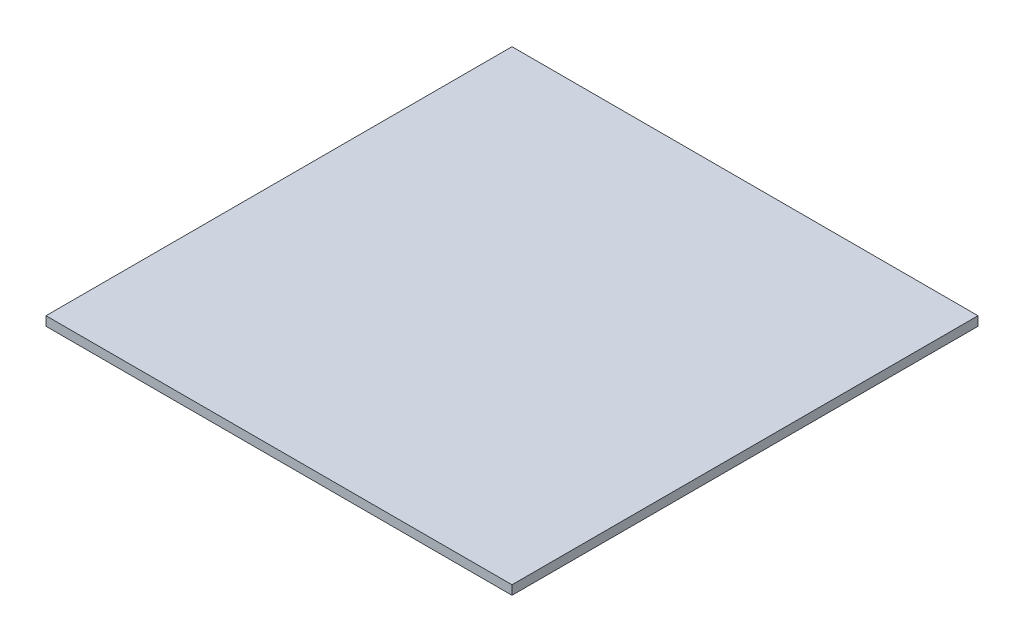
ISO-10303-21;
HEADER;
FILE_DESCRIPTION(('STEP AP214'),'2;1');
FILE_NAME('part.step','',(''),(''),'','','');
FILE_SCHEMA(('AUTOMOTIVE_DESIGN { 1 0 10303 214 1 1 1 1 }'));
ENDSEC;
DATA;
#1=APPLICATION_CONTEXT('core data for automotive mechanical design processes');
#2=APPLICATION_PROTOCOL_DEFINITION('international standard','automotive_design',2000,#1);
#3=PRODUCT_CONTEXT('',#1,'mechanical');
#4=PRODUCT('Part','Part','',(#3));
#5=PRODUCT_RELATED_PRODUCT_CATEGORY('part','',(#4));
#6=PRODUCT_DEFINITION_FORMATION('','',#4);
#7=PRODUCT_DEFINITION_CONTEXT('part definition',#1,'design');
#8=PRODUCT_DEFINITION('design','',#6,#7);
#9=PRODUCT_DEFINITION_SHAPE('','',#8);
#10=(LENGTH_UNIT() NAMED_UNIT(*) SI_UNIT(.MILLI.,.METRE.));
#11=(NAMED_UNIT(*) PLANE_ANGLE_UNIT() SI_UNIT($,.RADIAN.));
#12=(NAMED_UNIT(*) SI_UNIT($,.STERADIAN.) SOLID_ANGLE_UNIT());
#13=UNCERTAINTY_MEASURE_WITH_UNIT(LENGTH_MEASURE(1.E-05),#10,'distance_accuracy_value','');
#14=(GEOMETRIC_REPRESENTATION_CONTEXT(3) GLOBAL_UNCERTAINTY_ASSIGNED_CONTEXT((#13)) GLOBAL_UNIT_ASSIGNED_CONTEXT((#10,
#11,#12)) REPRESENTATION_CONTEXT('',''));
#15=CARTESIAN_POINT('',(0.,0.,0.));
#16=DIRECTION('',(0.,0.,1.));
#17=DIRECTION('',(1.,0.,0.));
#18=AXIS2_PLACEMENT_3D('',#15,#16,#17);
#19=CARTESIAN_POINT('',(152.4,5.9944,152.4));
#20=DIRECTION('',(-1.,0.,0.));
#21=DIRECTION('',(0.,0.,1.));
#22=AXIS2_PLACEMENT_3D('',#19,#20,#21);
#23=PLANE('',#22);
#24=DIRECTION('',(0.,0.,-1.));
#25=VECTOR('',#24,1.);
#26=CARTESIAN_POINT('',(152.4,0.,152.4));
#27=LINE('',#26,#25);
#28=CARTESIAN_POINT('',(152.4,0.,152.4));
#29=VERTEX_POINT('',#28);
#30=CARTESIAN_POINT('',(152.4,0.,-152.4));
#31=VERTEX_POINT('',#30);
#32=EDGE_CURVE('E96',#29,#31,#27,.T.);
#33=ORIENTED_EDGE('',*,*,#32,.T.);
#34=DIRECTION('',(0.,-1.,0.));
#35=VECTOR('',#34,1.);
#36=CARTESIAN_POINT('',(152.4,5.9944,-152.4));
#37=LINE('',#36,#35);
#38=CARTESIAN_POINT('',(152.4,5.9944,-152.4));
#39=VERTEX_POINT('',#38);
#40=EDGE_CURVE('E11',#39,#31,#37,.T.);
#41=ORIENTED_EDGE('',*,*,#40,.F.);
#42=DIRECTION('',(0.,0.,-1.));
#43=VECTOR('',#42,1.);
#44=CARTESIAN_POINT('',(152.4,5.9944,152.4));
#45=LINE('',#44,#43);
#46=CARTESIAN_POINT('',(152.4,5.9944,152.4));
#47=VERTEX_POINT('',#46);
#48=EDGE_CURVE('E84',#47,#39,#45,.T.);
#49=ORIENTED_EDGE('',*,*,#48,.F.);
#50=DIRECTION('',(0.,-1.,0.));
#51=VECTOR('',#50,1.);
#52=CARTESIAN_POINT('',(152.4,5.9944,152.4));
#53=LINE('',#52,#51);
#54=EDGE_CURVE('E92',#47,#29,#53,.T.);
#55=ORIENTED_EDGE('',*,*,#54,.T.);
#56=EDGE_LOOP('',(#33,#41,#49,#55));
#57=FACE_BOUND('',#56,.T.);
#58=ADVANCED_FACE('F33',(#57),#23,.F.);
#59=CARTESIAN_POINT('',(-152.4,5.9944,-152.4));
#60=DIRECTION('',(0.,0.,1.));
#61=DIRECTION('',(1.,0.,0.));
#62=AXIS2_PLACEMENT_3D('',#59,#60,#61);
#63=PLANE('',#62);
#64=DIRECTION('',(-1.,0.,0.));
#65=VECTOR('',#64,1.);
#66=CARTESIAN_POINT('',(-152.4,0.,-152.4));
#67=LINE('',#66,#65);
#68=CARTESIAN_POINT('',(-152.4,0.,-152.4));
#69=VERTEX_POINT('',#68);
#70=EDGE_CURVE('E88',#31,#69,#67,.T.);
#71=ORIENTED_EDGE('',*,*,#70,.T.);
#72=DIRECTION('',(0.,-1.,0.));
#73=VECTOR('',#72,1.);
#74=CARTESIAN_POINT('',(-152.4,5.9944,-152.4));
#75=LINE('',#74,#73);
#76=CARTESIAN_POINT('',(-152.4,5.9944,-152.4));
#77=VERTEX_POINT('',#76);
#78=EDGE_CURVE('E41',#77,#69,#75,.T.);
#79=ORIENTED_EDGE('',*,*,#78,.F.);
#80=DIRECTION('',(-1.,0.,0.));
#81=VECTOR('',#80,1.);
#82=CARTESIAN_POINT('',(-152.4,5.9944,-152.4));
#83=LINE('',#82,#81);
#84=EDGE_CURVE('E79',#39,#77,#83,.T.);
#85=ORIENTED_EDGE('',*,*,#84,.F.);
#86=ORIENTED_EDGE('',*,*,#40,.T.);
#87=EDGE_LOOP('',(#71,#79,#85,#86));
#88=FACE_BOUND('',#87,.T.);
#89=ADVANCED_FACE('F87',(#88),#63,.F.);
#90=CARTESIAN_POINT('',(-152.4,5.9944,152.4));
#91=DIRECTION('',(1.,0.,0.));
#92=DIRECTION('',(0.,0.,-1.));
#93=AXIS2_PLACEMENT_3D('',#90,#91,#92);
#94=PLANE('',#93);
#95=DIRECTION('',(0.,0.,1.));
#96=VECTOR('',#95,1.);
#97=CARTESIAN_POINT('',(-152.4,0.,152.4));
#98=LINE('',#97,#96);
#99=CARTESIAN_POINT('',(-152.4,0.,152.4));
#100=VERTEX_POINT('',#99);
#101=EDGE_CURVE('E66',#69,#100,#98,.T.);
#102=ORIENTED_EDGE('',*,*,#101,.T.);
#103=DIRECTION('',(0.,-1.,0.));
#104=VECTOR('',#103,1.);
#105=CARTESIAN_POINT('',(-152.4,5.9944,152.4));
#106=LINE('',#105,#104);
#107=CARTESIAN_POINT('',(-152.4,5.9944,152.4));
#108=VERTEX_POINT('',#107);
#109=EDGE_CURVE('E89',#108,#100,#106,.T.);
#110=ORIENTED_EDGE('',*,*,#109,.F.);
#111=DIRECTION('',(0.,0.,1.));
#112=VECTOR('',#111,1.);
#113=CARTESIAN_POINT('',(-152.4,5.9944,152.4));
#114=LINE('',#113,#112);
#115=EDGE_CURVE('E82',#77,#108,#114,.T.);
#116=ORIENTED_EDGE('',*,*,#115,.F.);
#117=ORIENTED_EDGE('',*,*,#78,.T.);
#118=EDGE_LOOP('',(#102,#110,#116,#117));
#119=FACE_BOUND('',#118,.T.);
#120=ADVANCED_FACE('F90',(#119),#94,.F.);
#121=CARTESIAN_POINT('',(-152.4,5.9944,152.4));
#122=DIRECTION('',(0.,0.,-1.));
#123=DIRECTION('',(-1.,0.,0.));
#124=AXIS2_PLACEMENT_3D('',#121,#122,#123);
#125=PLANE('',#124);
#126=DIRECTION('',(1.,0.,0.));
#127=VECTOR('',#126,1.);
#128=CARTESIAN_POINT('',(-152.4,0.,152.4));
#129=LINE('',#128,#127);
#130=EDGE_CURVE('E72',#100,#29,#129,.T.);
#131=ORIENTED_EDGE('',*,*,#130,.T.);
#132=ORIENTED_EDGE('',*,*,#54,.F.);
#133=DIRECTION('',(1.,0.,0.));
#134=VECTOR('',#133,1.);
#135=CARTESIAN_POINT('',(-152.4,5.9944,152.4));
#136=LINE('',#135,#134);
#137=EDGE_CURVE('E49',#108,#47,#136,.T.);
#138=ORIENTED_EDGE('',*,*,#137,.F.);
#139=ORIENTED_EDGE('',*,*,#109,.T.);
#140=EDGE_LOOP('',(#131,#132,#138,#139));
#141=FACE_BOUND('',#140,.T.);
#142=ADVANCED_FACE('F103',(#141),#125,.F.);
#143=CARTESIAN_POINT('',(0.,5.9944,0.));
#144=DIRECTION('',(0.,-1.,0.));
#145=DIRECTION('',(0.,0.,-1.));
#146=AXIS2_PLACEMENT_3D('',#143,#144,#145);
#147=PLANE('',#146);
#148=ORIENTED_EDGE('',*,*,#48,.T.);
#149=ORIENTED_EDGE('',*,*,#84,.T.);
#150=ORIENTED_EDGE('',*,*,#115,.T.);
#151=ORIENTED_EDGE('',*,*,#137,.T.);
#152=EDGE_LOOP('',(#148,#149,#150,#151));
#153=FACE_BOUND('',#152,.T.);
#154=ADVANCED_FACE('F80',(#153),#147,.F.);
#155=CARTESIAN_POINT('',(0.,0.,0.));
#156=DIRECTION('',(0.,-1.,0.));
#157=DIRECTION('',(0.,0.,-1.));
#158=AXIS2_PLACEMENT_3D('',#155,#156,#157);
#159=PLANE('',#158);
#160=ORIENTED_EDGE('',*,*,#32,.F.);
#161=ORIENTED_EDGE('',*,*,#130,.F.);
#162=ORIENTED_EDGE('',*,*,#101,.F.);
#163=ORIENTED_EDGE('',*,*,#70,.F.);
#164=EDGE_LOOP('',(#160,#161,#162,#163));
#165=FACE_BOUND('',#164,.T.);
#166=ADVANCED_FACE('F106',(#165),#159,.T.);
#167=CLOSED_SHELL('',(#58,#89,#120,#142,#154,#166));
#168=MANIFOLD_SOLID_BREP('B2',#167);
#169=ADVANCED_BREP_SHAPE_REPRESENTATION('',(#18,#168),#14);
#170=SHAPE_DEFINITION_REPRESENTATION(#9,#169);
ENDSEC;
END-ISO-10303-21;
